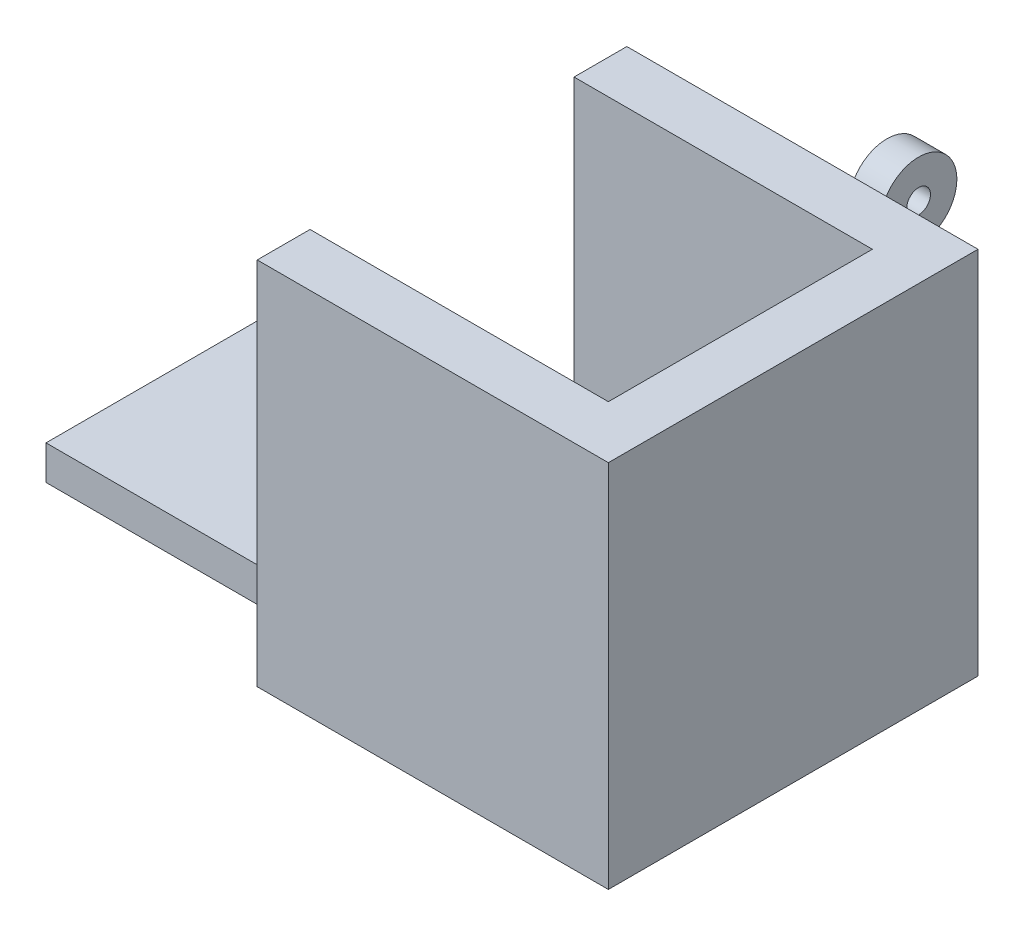
ISO-10303-21;
HEADER;
FILE_DESCRIPTION(('STEP AP214'),'2;1');
FILE_NAME('part.step','',(''),(''),'','','');
FILE_SCHEMA(('AUTOMOTIVE_DESIGN { 1 0 10303 214 1 1 1 1 }'));
ENDSEC;
DATA;
#1=APPLICATION_CONTEXT('core data for automotive mechanical design processes');
#2=APPLICATION_PROTOCOL_DEFINITION('international standard','automotive_design',2000,#1);
#3=PRODUCT_CONTEXT('',#1,'mechanical');
#4=PRODUCT('Part','Part','',(#3));
#5=PRODUCT_RELATED_PRODUCT_CATEGORY('part','',(#4));
#6=PRODUCT_DEFINITION_FORMATION('','',#4);
#7=PRODUCT_DEFINITION_CONTEXT('part definition',#1,'design');
#8=PRODUCT_DEFINITION('design','',#6,#7);
#9=PRODUCT_DEFINITION_SHAPE('','',#8);
#10=(LENGTH_UNIT() NAMED_UNIT(*) SI_UNIT(.MILLI.,.METRE.));
#11=(NAMED_UNIT(*) PLANE_ANGLE_UNIT() SI_UNIT($,.RADIAN.));
#12=(NAMED_UNIT(*) SI_UNIT($,.STERADIAN.) SOLID_ANGLE_UNIT());
#13=UNCERTAINTY_MEASURE_WITH_UNIT(LENGTH_MEASURE(1.E-05),#10,'distance_accuracy_value','');
#14=(GEOMETRIC_REPRESENTATION_CONTEXT(3) GLOBAL_UNCERTAINTY_ASSIGNED_CONTEXT((#13)) GLOBAL_UNIT_ASSIGNED_CONTEXT((#10,
#11,#12)) REPRESENTATION_CONTEXT('',''));
#15=CARTESIAN_POINT('',(0.,0.,0.));
#16=DIRECTION('',(0.,0.,1.));
#17=DIRECTION('',(1.,0.,0.));
#18=AXIS2_PLACEMENT_3D('',#15,#16,#17);
#19=CARTESIAN_POINT('',(-66.5,140.,-70.));
#20=DIRECTION('',(0.,0.,1.));
#21=DIRECTION('',(1.,0.,0.));
#22=AXIS2_PLACEMENT_3D('',#19,#20,#21);
#23=PLANE('',#22);
#24=DIRECTION('',(-1.,0.,0.));
#25=VECTOR('',#24,1.);
#26=CARTESIAN_POINT('',(-66.5,0.,-70.));
#27=LINE('',#26,#25);
#28=CARTESIAN_POINT('',(66.5,0.,-70.));
#29=VERTEX_POINT('',#28);
#30=CARTESIAN_POINT('',(-66.5,0.,-70.));
#31=VERTEX_POINT('',#30);
#32=EDGE_CURVE('E254',#29,#31,#27,.T.);
#33=ORIENTED_EDGE('',*,*,#32,.T.);
#34=DIRECTION('',(0.,-1.,0.));
#35=VECTOR('',#34,1.);
#36=CARTESIAN_POINT('',(-66.5,140.,-70.));
#37=LINE('',#36,#35);
#38=CARTESIAN_POINT('',(-66.5,140.,-70.));
#39=VERTEX_POINT('',#38);
#40=EDGE_CURVE('E46',#39,#31,#37,.T.);
#41=ORIENTED_EDGE('',*,*,#40,.F.);
#42=DIRECTION('',(-1.,0.,0.));
#43=VECTOR('',#42,1.);
#44=CARTESIAN_POINT('',(-66.5,140.,-70.));
#45=LINE('',#44,#43);
#46=CARTESIAN_POINT('',(66.5,140.,-70.));
#47=VERTEX_POINT('',#46);
#48=EDGE_CURVE('E242',#47,#39,#45,.T.);
#49=ORIENTED_EDGE('',*,*,#48,.F.);
#50=DIRECTION('',(0.,-1.,0.));
#51=VECTOR('',#50,1.);
#52=CARTESIAN_POINT('',(66.5,140.,-70.));
#53=LINE('',#52,#51);
#54=EDGE_CURVE('E12',#47,#29,#53,.T.);
#55=ORIENTED_EDGE('',*,*,#54,.T.);
#56=EDGE_LOOP('',(#33,#41,#49,#55));
#57=FACE_BOUND('',#56,.T.);
#58=DIRECTION('',(1.,0.,0.));
#59=VECTOR('',#58,1.);
#60=CARTESIAN_POINT('',(19.5,139.330471622785,-70.));
#61=LINE('',#60,#59);
#62=CARTESIAN_POINT('',(31.5,139.330471622785,-70.));
#63=VERTEX_POINT('',#62);
#64=CARTESIAN_POINT('',(19.5,139.330471622785,-70.));
#65=VERTEX_POINT('',#64);
#66=EDGE_CURVE('E150',#63,#65,#61,.F.);
#67=ORIENTED_EDGE('',*,*,#66,.T.);
#68=DIRECTION('',(0.,1.,0.));
#69=VECTOR('',#68,1.);
#70=CARTESIAN_POINT('',(19.5,132.,-70.));
#71=LINE('',#70,#69);
#72=CARTESIAN_POINT('',(19.5,120.,-70.));
#73=VERTEX_POINT('',#72);
#74=EDGE_CURVE('E53',#73,#65,#71,.T.);
#75=ORIENTED_EDGE('',*,*,#74,.F.);
#76=DIRECTION('',(-1.,0.,0.));
#77=VECTOR('',#76,1.);
#78=CARTESIAN_POINT('',(31.5,120.,-70.));
#79=LINE('',#78,#77);
#80=CARTESIAN_POINT('',(31.5,120.,-70.));
#81=VERTEX_POINT('',#80);
#82=EDGE_CURVE('E485',#81,#73,#79,.T.);
#83=ORIENTED_EDGE('',*,*,#82,.F.);
#84=DIRECTION('',(0.,-1.,0.));
#85=VECTOR('',#84,1.);
#86=CARTESIAN_POINT('',(31.5,132.,-70.));
#87=LINE('',#86,#85);
#88=EDGE_CURVE('E60',#63,#81,#87,.T.);
#89=ORIENTED_EDGE('',*,*,#88,.F.);
#90=EDGE_LOOP('',(#67,#75,#83,#89));
#91=FACE_BOUND('',#90,.T.);
#92=ADVANCED_FACE('F38',(#57,#91),#23,.F.);
#93=CARTESIAN_POINT('',(-66.5,140.,-70.));
#94=DIRECTION('',(1.,0.,0.));
#95=DIRECTION('',(0.,0.,-1.));
#96=AXIS2_PLACEMENT_3D('',#93,#94,#95);
#97=PLANE('',#96);
#98=DIRECTION('',(0.,0.,1.));
#99=VECTOR('',#98,1.);
#100=CARTESIAN_POINT('',(-66.5,30.,-50.));
#101=LINE('',#100,#99);
#102=CARTESIAN_POINT('',(-66.5,30.,-50.));
#103=VERTEX_POINT('',#102);
#104=CARTESIAN_POINT('',(-66.5,30.,50.));
#105=VERTEX_POINT('',#104);
#106=EDGE_CURVE('E210',#103,#105,#101,.T.);
#107=ORIENTED_EDGE('',*,*,#106,.F.);
#108=DIRECTION('',(0.,1.,0.));
#109=VECTOR('',#108,1.);
#110=CARTESIAN_POINT('',(-66.5,30.,-50.));
#111=LINE('',#110,#109);
#112=CARTESIAN_POINT('',(-66.5,140.,-50.));
#113=VERTEX_POINT('',#112);
#114=EDGE_CURVE('E230',#103,#113,#111,.T.);
#115=ORIENTED_EDGE('',*,*,#114,.T.);
#116=DIRECTION('',(0.,0.,1.));
#117=VECTOR('',#116,1.);
#118=CARTESIAN_POINT('',(-66.5,140.,-70.));
#119=LINE('',#118,#117);
#120=EDGE_CURVE('E246',#39,#113,#119,.T.);
#121=ORIENTED_EDGE('',*,*,#120,.F.);
#122=ORIENTED_EDGE('',*,*,#40,.T.);
#123=DIRECTION('',(0.,0.,1.));
#124=VECTOR('',#123,1.);
#125=CARTESIAN_POINT('',(-66.5,0.,-70.));
#126=LINE('',#125,#124);
#127=CARTESIAN_POINT('',(-66.5,0.,70.));
#128=VERTEX_POINT('',#127);
#129=EDGE_CURVE('E256',#31,#128,#126,.T.);
#130=ORIENTED_EDGE('',*,*,#129,.T.);
#131=DIRECTION('',(0.,-1.,0.));
#132=VECTOR('',#131,1.);
#133=CARTESIAN_POINT('',(-66.5,140.,70.));
#134=LINE('',#133,#132);
#135=CARTESIAN_POINT('',(-66.5,140.,70.));
#136=VERTEX_POINT('',#135);
#137=EDGE_CURVE('E261',#136,#128,#134,.T.);
#138=ORIENTED_EDGE('',*,*,#137,.F.);
#139=CARTESIAN_POINT('',(-66.5,140.,50.));
#140=VERTEX_POINT('',#139);
#141=EDGE_CURVE('E245',#140,#136,#119,.T.);
#142=ORIENTED_EDGE('',*,*,#141,.F.);
#143=DIRECTION('',(0.,1.,0.));
#144=VECTOR('',#143,1.);
#145=CARTESIAN_POINT('',(-66.5,30.,50.));
#146=LINE('',#145,#144);
#147=EDGE_CURVE('E223',#105,#140,#146,.T.);
#148=ORIENTED_EDGE('',*,*,#147,.F.);
#149=EDGE_LOOP('',(#107,#115,#121,#122,#130,#138,#142,#148));
#150=FACE_BOUND('',#149,.T.);
#151=DIRECTION('',(0.,-1.,0.));
#152=VECTOR('',#151,1.);
#153=CARTESIAN_POINT('',(-66.5,20.,-50.));
#154=LINE('',#153,#152);
#155=CARTESIAN_POINT('',(-66.5,20.,-50.));
#156=VERTEX_POINT('',#155);
#157=CARTESIAN_POINT('',(-66.5,7.00000000000001,-50.));
#158=VERTEX_POINT('',#157);
#159=EDGE_CURVE('E176',#156,#158,#154,.T.);
#160=ORIENTED_EDGE('',*,*,#159,.F.);
#161=DIRECTION('',(0.,0.,-1.));
#162=VECTOR('',#161,1.);
#163=CARTESIAN_POINT('',(-66.5,20.,-50.));
#164=LINE('',#163,#162);
#165=CARTESIAN_POINT('',(-66.5,20.,50.));
#166=VERTEX_POINT('',#165);
#167=EDGE_CURVE('E181',#166,#156,#164,.T.);
#168=ORIENTED_EDGE('',*,*,#167,.F.);
#169=DIRECTION('',(0.,1.,0.));
#170=VECTOR('',#169,1.);
#171=CARTESIAN_POINT('',(-66.5,20.,50.));
#172=LINE('',#171,#170);
#173=CARTESIAN_POINT('',(-66.5,7.00000000000001,50.));
#174=VERTEX_POINT('',#173);
#175=EDGE_CURVE('E193',#174,#166,#172,.T.);
#176=ORIENTED_EDGE('',*,*,#175,.F.);
#177=DIRECTION('',(0.,0.,1.));
#178=VECTOR('',#177,1.);
#179=CARTESIAN_POINT('',(-66.5,7.,-50.));
#180=LINE('',#179,#178);
#181=EDGE_CURVE('E190',#158,#174,#180,.T.);
#182=ORIENTED_EDGE('',*,*,#181,.F.);
#183=EDGE_LOOP('',(#160,#168,#176,#182));
#184=FACE_BOUND('',#183,.T.);
#185=ADVANCED_FACE('F269',(#150,#184),#97,.F.);
#186=CARTESIAN_POINT('',(66.5,140.,-70.));
#187=DIRECTION('',(-1.,0.,0.));
#188=DIRECTION('',(0.,0.,1.));
#189=AXIS2_PLACEMENT_3D('',#186,#187,#188);
#190=PLANE('',#189);
#191=DIRECTION('',(0.,0.,-1.));
#192=VECTOR('',#191,1.);
#193=CARTESIAN_POINT('',(66.5,0.,-70.));
#194=LINE('',#193,#192);
#195=CARTESIAN_POINT('',(66.5,0.,70.));
#196=VERTEX_POINT('',#195);
#197=EDGE_CURVE('E233',#196,#29,#194,.T.);
#198=ORIENTED_EDGE('',*,*,#197,.T.);
#199=ORIENTED_EDGE('',*,*,#54,.F.);
#200=DIRECTION('',(0.,0.,-1.));
#201=VECTOR('',#200,1.);
#202=CARTESIAN_POINT('',(66.5,140.,-70.));
#203=LINE('',#202,#201);
#204=CARTESIAN_POINT('',(66.5,140.,70.));
#205=VERTEX_POINT('',#204);
#206=EDGE_CURVE('E239',#205,#47,#203,.T.);
#207=ORIENTED_EDGE('',*,*,#206,.F.);
#208=DIRECTION('',(0.,-1.,0.));
#209=VECTOR('',#208,1.);
#210=CARTESIAN_POINT('',(66.5,140.,70.));
#211=LINE('',#210,#209);
#212=EDGE_CURVE('E251',#205,#196,#211,.T.);
#213=ORIENTED_EDGE('',*,*,#212,.T.);
#214=EDGE_LOOP('',(#198,#199,#207,#213));
#215=FACE_BOUND('',#214,.T.);
#216=ADVANCED_FACE('F40',(#215),#190,.F.);
#217=CARTESIAN_POINT('',(-66.5,140.,70.));
#218=DIRECTION('',(0.,0.,-1.));
#219=DIRECTION('',(-1.,0.,0.));
#220=AXIS2_PLACEMENT_3D('',#217,#218,#219);
#221=PLANE('',#220);
#222=DIRECTION('',(1.,0.,0.));
#223=VECTOR('',#222,1.);
#224=CARTESIAN_POINT('',(-66.5,0.,70.));
#225=LINE('',#224,#223);
#226=EDGE_CURVE('E243',#128,#196,#225,.T.);
#227=ORIENTED_EDGE('',*,*,#226,.T.);
#228=ORIENTED_EDGE('',*,*,#212,.F.);
#229=DIRECTION('',(1.,0.,0.));
#230=VECTOR('',#229,1.);
#231=CARTESIAN_POINT('',(-66.5,140.,70.));
#232=LINE('',#231,#230);
#233=EDGE_CURVE('E249',#136,#205,#232,.T.);
#234=ORIENTED_EDGE('',*,*,#233,.F.);
#235=ORIENTED_EDGE('',*,*,#137,.T.);
#236=EDGE_LOOP('',(#227,#228,#234,#235));
#237=FACE_BOUND('',#236,.T.);
#238=ADVANCED_FACE('F279',(#237),#221,.F.);
#239=CARTESIAN_POINT('',(0.,140.,0.));
#240=DIRECTION('',(0.,1.,0.));
#241=DIRECTION('',(0.,0.,1.));
#242=AXIS2_PLACEMENT_3D('',#239,#240,#241);
#243=PLANE('',#242);
#244=DIRECTION('',(-1.,0.,0.));
#245=VECTOR('',#244,1.);
#246=CARTESIAN_POINT('',(-66.5,140.,-50.));
#247=LINE('',#246,#245);
#248=CARTESIAN_POINT('',(46.5,140.,-50.));
#249=VERTEX_POINT('',#248);
#250=EDGE_CURVE('E214',#249,#113,#247,.T.);
#251=ORIENTED_EDGE('',*,*,#250,.F.);
#252=DIRECTION('',(0.,0.,-1.));
#253=VECTOR('',#252,1.);
#254=CARTESIAN_POINT('',(46.5,140.,-50.));
#255=LINE('',#254,#253);
#256=CARTESIAN_POINT('',(46.5,140.,50.));
#257=VERTEX_POINT('',#256);
#258=EDGE_CURVE('E226',#257,#249,#255,.T.);
#259=ORIENTED_EDGE('',*,*,#258,.F.);
#260=DIRECTION('',(1.,0.,0.));
#261=VECTOR('',#260,1.);
#262=CARTESIAN_POINT('',(-66.5,140.,50.));
#263=LINE('',#262,#261);
#264=EDGE_CURVE('E209',#140,#257,#263,.T.);
#265=ORIENTED_EDGE('',*,*,#264,.F.);
#266=ORIENTED_EDGE('',*,*,#141,.T.);
#267=ORIENTED_EDGE('',*,*,#233,.T.);
#268=ORIENTED_EDGE('',*,*,#206,.T.);
#269=ORIENTED_EDGE('',*,*,#48,.T.);
#270=ORIENTED_EDGE('',*,*,#120,.T.);
#271=EDGE_LOOP('',(#251,#259,#265,#266,#267,#268,#269,#270));
#272=FACE_BOUND('',#271,.T.);
#273=ADVANCED_FACE('F286',(#272),#243,.T.);
#274=CARTESIAN_POINT('',(0.,0.,0.));
#275=DIRECTION('',(0.,1.,0.));
#276=DIRECTION('',(0.,0.,1.));
#277=AXIS2_PLACEMENT_3D('',#274,#275,#276);
#278=PLANE('',#277);
#279=ORIENTED_EDGE('',*,*,#197,.F.);
#280=ORIENTED_EDGE('',*,*,#226,.F.);
#281=ORIENTED_EDGE('',*,*,#129,.F.);
#282=ORIENTED_EDGE('',*,*,#32,.F.);
#283=EDGE_LOOP('',(#279,#280,#281,#282));
#284=FACE_BOUND('',#283,.T.);
#285=ADVANCED_FACE('F276',(#284),#278,.F.);
#286=CARTESIAN_POINT('',(-66.5,30.,-50.));
#287=DIRECTION('',(0.,0.,-1.));
#288=DIRECTION('',(-1.,0.,0.));
#289=AXIS2_PLACEMENT_3D('',#286,#287,#288);
#290=PLANE('',#289);
#291=ORIENTED_EDGE('',*,*,#250,.T.);
#292=ORIENTED_EDGE('',*,*,#114,.F.);
#293=DIRECTION('',(-1.,0.,0.));
#294=VECTOR('',#293,1.);
#295=CARTESIAN_POINT('',(-66.5,30.,-50.));
#296=LINE('',#295,#294);
#297=CARTESIAN_POINT('',(46.5,30.,-50.));
#298=VERTEX_POINT('',#297);
#299=EDGE_CURVE('E220',#298,#103,#296,.T.);
#300=ORIENTED_EDGE('',*,*,#299,.F.);
#301=DIRECTION('',(0.,1.,0.));
#302=VECTOR('',#301,1.);
#303=CARTESIAN_POINT('',(46.5,30.,-50.));
#304=LINE('',#303,#302);
#305=EDGE_CURVE('E234',#298,#249,#304,.T.);
#306=ORIENTED_EDGE('',*,*,#305,.T.);
#307=EDGE_LOOP('',(#291,#292,#300,#306));
#308=FACE_BOUND('',#307,.T.);
#309=ADVANCED_FACE('F298',(#308),#290,.F.);
#310=CARTESIAN_POINT('',(46.5,30.,-50.));
#311=DIRECTION('',(1.,0.,0.));
#312=DIRECTION('',(0.,0.,-1.));
#313=AXIS2_PLACEMENT_3D('',#310,#311,#312);
#314=PLANE('',#313);
#315=ORIENTED_EDGE('',*,*,#258,.T.);
#316=ORIENTED_EDGE('',*,*,#305,.F.);
#317=DIRECTION('',(0.,0.,-1.));
#318=VECTOR('',#317,1.);
#319=CARTESIAN_POINT('',(46.5,30.,-50.));
#320=LINE('',#319,#318);
#321=CARTESIAN_POINT('',(46.5,30.,50.));
#322=VERTEX_POINT('',#321);
#323=EDGE_CURVE('E217',#322,#298,#320,.T.);
#324=ORIENTED_EDGE('',*,*,#323,.F.);
#325=DIRECTION('',(0.,1.,0.));
#326=VECTOR('',#325,1.);
#327=CARTESIAN_POINT('',(46.5,30.,50.));
#328=LINE('',#327,#326);
#329=EDGE_CURVE('E236',#322,#257,#328,.T.);
#330=ORIENTED_EDGE('',*,*,#329,.T.);
#331=EDGE_LOOP('',(#315,#316,#324,#330));
#332=FACE_BOUND('',#331,.T.);
#333=ADVANCED_FACE('F300',(#332),#314,.F.);
#334=CARTESIAN_POINT('',(-66.5,30.,50.));
#335=DIRECTION('',(0.,0.,1.));
#336=DIRECTION('',(1.,0.,0.));
#337=AXIS2_PLACEMENT_3D('',#334,#335,#336);
#338=PLANE('',#337);
#339=ORIENTED_EDGE('',*,*,#264,.T.);
#340=ORIENTED_EDGE('',*,*,#329,.F.);
#341=DIRECTION('',(1.,0.,0.));
#342=VECTOR('',#341,1.);
#343=CARTESIAN_POINT('',(-66.5,30.,50.));
#344=LINE('',#343,#342);
#345=EDGE_CURVE('E213',#105,#322,#344,.T.);
#346=ORIENTED_EDGE('',*,*,#345,.F.);
#347=ORIENTED_EDGE('',*,*,#147,.T.);
#348=EDGE_LOOP('',(#339,#340,#346,#347));
#349=FACE_BOUND('',#348,.T.);
#350=ADVANCED_FACE('F292',(#349),#338,.F.);
#351=CARTESIAN_POINT('',(0.,30.,0.));
#352=DIRECTION('',(0.,1.,0.));
#353=DIRECTION('',(0.,0.,1.));
#354=AXIS2_PLACEMENT_3D('',#351,#352,#353);
#355=PLANE('',#354);
#356=ORIENTED_EDGE('',*,*,#106,.T.);
#357=ORIENTED_EDGE('',*,*,#345,.T.);
#358=ORIENTED_EDGE('',*,*,#323,.T.);
#359=ORIENTED_EDGE('',*,*,#299,.T.);
#360=EDGE_LOOP('',(#356,#357,#358,#359));
#361=FACE_BOUND('',#360,.T.);
#362=ADVANCED_FACE('F295',(#361),#355,.T.);
#363=CARTESIAN_POINT('',(-166.5,20.,-50.));
#364=DIRECTION('',(0.,0.,1.));
#365=DIRECTION('',(1.,0.,0.));
#366=AXIS2_PLACEMENT_3D('',#363,#364,#365);
#367=PLANE('',#366);
#368=ORIENTED_EDGE('',*,*,#159,.T.);
#369=DIRECTION('',(1.,0.,0.));
#370=VECTOR('',#369,1.);
#371=CARTESIAN_POINT('',(-166.5,7.,-50.));
#372=LINE('',#371,#370);
#373=CARTESIAN_POINT('',(-166.5,7.,-50.));
#374=VERTEX_POINT('',#373);
#375=EDGE_CURVE('E206',#374,#158,#372,.T.);
#376=ORIENTED_EDGE('',*,*,#375,.F.);
#377=DIRECTION('',(0.,-1.,0.));
#378=VECTOR('',#377,1.);
#379=CARTESIAN_POINT('',(-166.5,20.,-50.));
#380=LINE('',#379,#378);
#381=CARTESIAN_POINT('',(-166.5,20.,-50.));
#382=VERTEX_POINT('',#381);
#383=EDGE_CURVE('E177',#382,#374,#380,.T.);
#384=ORIENTED_EDGE('',*,*,#383,.F.);
#385=DIRECTION('',(1.,0.,0.));
#386=VECTOR('',#385,1.);
#387=CARTESIAN_POINT('',(-166.5,20.,-50.));
#388=LINE('',#387,#386);
#389=EDGE_CURVE('E187',#382,#156,#388,.T.);
#390=ORIENTED_EDGE('',*,*,#389,.T.);
#391=EDGE_LOOP('',(#368,#376,#384,#390));
#392=FACE_BOUND('',#391,.T.);
#393=ADVANCED_FACE('F352',(#392),#367,.F.);
#394=CARTESIAN_POINT('',(-166.5,7.,-50.));
#395=DIRECTION('',(0.,1.,0.));
#396=DIRECTION('',(0.,0.,1.));
#397=AXIS2_PLACEMENT_3D('',#394,#395,#396);
#398=PLANE('',#397);
#399=CARTESIAN_POINT('',(-86.5,7.,0.));
#400=DIRECTION('',(0.,1.,0.));
#401=DIRECTION('',(0.,0.,1.));
#402=AXIS2_PLACEMENT_3D('',#399,#400,#401);
#403=CIRCLE('',#402,3.00000000000001);
#404=CARTESIAN_POINT('',(-86.5,7.,3.00000000000001));
#405=VERTEX_POINT('',#404);
#406=EDGE_CURVE('E169',#405,#405,#403,.T.);
#407=ORIENTED_EDGE('',*,*,#406,.T.);
#408=EDGE_LOOP('',(#407));
#409=FACE_BOUND('',#408,.T.);
#410=ORIENTED_EDGE('',*,*,#181,.T.);
#411=DIRECTION('',(1.,0.,0.));
#412=VECTOR('',#411,1.);
#413=CARTESIAN_POINT('',(-166.5,7.,50.));
#414=LINE('',#413,#412);
#415=CARTESIAN_POINT('',(-166.5,7.,50.));
#416=VERTEX_POINT('',#415);
#417=EDGE_CURVE('E203',#416,#174,#414,.T.);
#418=ORIENTED_EDGE('',*,*,#417,.F.);
#419=DIRECTION('',(0.,0.,1.));
#420=VECTOR('',#419,1.);
#421=CARTESIAN_POINT('',(-166.5,7.,-50.));
#422=LINE('',#421,#420);
#423=EDGE_CURVE('E180',#374,#416,#422,.T.);
#424=ORIENTED_EDGE('',*,*,#423,.F.);
#425=ORIENTED_EDGE('',*,*,#375,.T.);
#426=EDGE_LOOP('',(#410,#418,#424,#425));
#427=FACE_BOUND('',#426,.T.);
#428=ADVANCED_FACE('F367',(#409,#427),#398,.F.);
#429=CARTESIAN_POINT('',(-166.5,20.,50.));
#430=DIRECTION('',(0.,0.,-1.));
#431=DIRECTION('',(-1.,0.,0.));
#432=AXIS2_PLACEMENT_3D('',#429,#430,#431);
#433=PLANE('',#432);
#434=ORIENTED_EDGE('',*,*,#175,.T.);
#435=DIRECTION('',(1.,0.,0.));
#436=VECTOR('',#435,1.);
#437=CARTESIAN_POINT('',(-166.5,20.,50.));
#438=LINE('',#437,#436);
#439=CARTESIAN_POINT('',(-166.5,20.,50.));
#440=VERTEX_POINT('',#439);
#441=EDGE_CURVE('E200',#440,#166,#438,.T.);
#442=ORIENTED_EDGE('',*,*,#441,.F.);
#443=DIRECTION('',(0.,1.,0.));
#444=VECTOR('',#443,1.);
#445=CARTESIAN_POINT('',(-166.5,20.,50.));
#446=LINE('',#445,#444);
#447=EDGE_CURVE('E183',#416,#440,#446,.T.);
#448=ORIENTED_EDGE('',*,*,#447,.F.);
#449=ORIENTED_EDGE('',*,*,#417,.T.);
#450=EDGE_LOOP('',(#434,#442,#448,#449));
#451=FACE_BOUND('',#450,.T.);
#452=ADVANCED_FACE('F375',(#451),#433,.F.);
#453=CARTESIAN_POINT('',(-166.5,20.,-50.));
#454=DIRECTION('',(0.,-1.,0.));
#455=DIRECTION('',(0.,0.,-1.));
#456=AXIS2_PLACEMENT_3D('',#453,#454,#455);
#457=PLANE('',#456);
#458=CARTESIAN_POINT('',(-86.5,20.,0.));
#459=DIRECTION('',(0.,1.,0.));
#460=DIRECTION('',(0.,0.,1.));
#461=AXIS2_PLACEMENT_3D('',#458,#459,#460);
#462=CIRCLE('',#461,3.00000000000001);
#463=CARTESIAN_POINT('',(-86.5,20.,3.00000000000001));
#464=VERTEX_POINT('',#463);
#465=EDGE_CURVE('E166',#464,#464,#462,.T.);
#466=ORIENTED_EDGE('',*,*,#465,.F.);
#467=EDGE_LOOP('',(#466));
#468=FACE_BOUND('',#467,.T.);
#469=ORIENTED_EDGE('',*,*,#167,.T.);
#470=ORIENTED_EDGE('',*,*,#389,.F.);
#471=DIRECTION('',(0.,0.,-1.));
#472=VECTOR('',#471,1.);
#473=CARTESIAN_POINT('',(-166.5,20.,-50.));
#474=LINE('',#473,#472);
#475=EDGE_CURVE('E185',#440,#382,#474,.T.);
#476=ORIENTED_EDGE('',*,*,#475,.F.);
#477=ORIENTED_EDGE('',*,*,#441,.T.);
#478=EDGE_LOOP('',(#469,#470,#476,#477));
#479=FACE_BOUND('',#478,.T.);
#480=ADVANCED_FACE('F380',(#468,#479),#457,.F.);
#481=CARTESIAN_POINT('',(-166.5,0.,0.));
#482=DIRECTION('',(-1.,0.,0.));
#483=DIRECTION('',(0.,0.,1.));
#484=AXIS2_PLACEMENT_3D('',#481,#482,#483);
#485=PLANE('',#484);
#486=ORIENTED_EDGE('',*,*,#383,.T.);
#487=ORIENTED_EDGE('',*,*,#423,.T.);
#488=ORIENTED_EDGE('',*,*,#447,.T.);
#489=ORIENTED_EDGE('',*,*,#475,.T.);
#490=EDGE_LOOP('',(#486,#487,#488,#489));
#491=FACE_BOUND('',#490,.T.);
#492=ADVANCED_FACE('F388',(#491),#485,.T.);
#493=CARTESIAN_POINT('',(-86.5,0.,0.));
#494=DIRECTION('',(0.,1.,0.));
#495=DIRECTION('',(0.,0.,1.));
#496=AXIS2_PLACEMENT_3D('',#493,#494,#495);
#497=CYLINDRICAL_SURFACE('',#496,3.00000000000001);
#498=ORIENTED_EDGE('',*,*,#465,.T.);
#499=EDGE_LOOP('',(#498));
#500=FACE_BOUND('',#499,.T.);
#501=ORIENTED_EDGE('',*,*,#406,.F.);
#502=EDGE_LOOP('',(#501));
#503=FACE_BOUND('',#502,.T.);
#504=ADVANCED_FACE('F393',(#500,#503),#497,.F.);
#505=CARTESIAN_POINT('',(31.5,132.,-80.));
#506=DIRECTION('',(-1.,0.,0.));
#507=DIRECTION('',(0.,0.,1.));
#508=AXIS2_PLACEMENT_3D('',#505,#506,#507);
#509=PLANE('',#508);
#510=DIRECTION('',(0.,0.,1.));
#511=VECTOR('',#510,1.);
#512=CARTESIAN_POINT('',(31.5,120.,-80.));
#513=LINE('',#512,#511);
#514=CARTESIAN_POINT('',(31.5,120.,-74.3768347171525));
#515=VERTEX_POINT('',#514);
#516=EDGE_CURVE('E161',#515,#81,#513,.T.);
#517=ORIENTED_EDGE('',*,*,#516,.F.);
#518=CARTESIAN_POINT('',(31.5,132.,-82.5));
#519=DIRECTION('',(1.,0.,0.));
#520=DIRECTION('',(0.,0.,-1.));
#521=AXIS2_PLACEMENT_3D('',#518,#519,#520);
#522=CIRCLE('',#521,14.4908872817526);
#523=EDGE_CURVE('E145',#515,#63,#522,.T.);
#524=ORIENTED_EDGE('',*,*,#523,.T.);
#525=ORIENTED_EDGE('',*,*,#88,.T.);
#526=EDGE_LOOP('',(#517,#524,#525));
#527=FACE_BOUND('',#526,.T.);
#528=CARTESIAN_POINT('',(31.5,132.,-82.5));
#529=DIRECTION('',(1.,0.,0.));
#530=DIRECTION('',(0.,0.,-1.));
#531=AXIS2_PLACEMENT_3D('',#528,#529,#530);
#532=CIRCLE('',#531,4.4908872817526);
#533=CARTESIAN_POINT('',(31.5,132.,-86.9908872817526));
#534=VERTEX_POINT('',#533);
#535=EDGE_CURVE('E478',#534,#534,#532,.T.);
#536=ORIENTED_EDGE('',*,*,#535,.F.);
#537=EDGE_LOOP('',(#536));
#538=FACE_BOUND('',#537,.T.);
#539=ADVANCED_FACE('F164',(#527,#538),#509,.F.);
#540=CARTESIAN_POINT('',(31.5,120.,-80.));
#541=DIRECTION('',(0.,1.,0.));
#542=DIRECTION('',(0.,0.,1.));
#543=AXIS2_PLACEMENT_3D('',#540,#541,#542);
#544=PLANE('',#543);
#545=DIRECTION('',(0.,0.,1.));
#546=VECTOR('',#545,1.);
#547=CARTESIAN_POINT('',(19.5,120.,-80.));
#548=LINE('',#547,#546);
#549=CARTESIAN_POINT('',(19.5,120.,-74.3768347171525));
#550=VERTEX_POINT('',#549);
#551=EDGE_CURVE('E162',#550,#73,#548,.T.);
#552=ORIENTED_EDGE('',*,*,#551,.F.);
#553=DIRECTION('',(1.,0.,0.));
#554=VECTOR('',#553,1.);
#555=CARTESIAN_POINT('',(19.5,120.,-74.3768347171525));
#556=LINE('',#555,#554);
#557=EDGE_CURVE('E149',#550,#515,#556,.T.);
#558=ORIENTED_EDGE('',*,*,#557,.T.);
#559=ORIENTED_EDGE('',*,*,#516,.T.);
#560=ORIENTED_EDGE('',*,*,#82,.T.);
#561=EDGE_LOOP('',(#552,#558,#559,#560));
#562=FACE_BOUND('',#561,.T.);
#563=ADVANCED_FACE('F159',(#562),#544,.F.);
#564=CARTESIAN_POINT('',(19.5,132.,-80.));
#565=DIRECTION('',(1.,0.,0.));
#566=DIRECTION('',(0.,0.,-1.));
#567=AXIS2_PLACEMENT_3D('',#564,#565,#566);
#568=PLANE('',#567);
#569=CARTESIAN_POINT('',(19.5,132.,-82.5));
#570=DIRECTION('',(1.,0.,0.));
#571=DIRECTION('',(0.,0.,-1.));
#572=AXIS2_PLACEMENT_3D('',#569,#570,#571);
#573=CIRCLE('',#572,14.4908872817526);
#574=EDGE_CURVE('E153',#550,#65,#573,.T.);
#575=ORIENTED_EDGE('',*,*,#574,.F.);
#576=ORIENTED_EDGE('',*,*,#551,.T.);
#577=ORIENTED_EDGE('',*,*,#74,.T.);
#578=EDGE_LOOP('',(#575,#576,#577));
#579=FACE_BOUND('',#578,.T.);
#580=CARTESIAN_POINT('',(19.5,132.,-82.5));
#581=DIRECTION('',(1.,0.,0.));
#582=DIRECTION('',(0.,0.,-1.));
#583=AXIS2_PLACEMENT_3D('',#580,#581,#582);
#584=CIRCLE('',#583,4.4908872817526);
#585=CARTESIAN_POINT('',(19.5,132.,-86.9908872817526));
#586=VERTEX_POINT('',#585);
#587=EDGE_CURVE('E154',#586,#586,#584,.T.);
#588=ORIENTED_EDGE('',*,*,#587,.T.);
#589=EDGE_LOOP('',(#588));
#590=FACE_BOUND('',#589,.T.);
#591=ADVANCED_FACE('F434',(#579,#590),#568,.F.);
#592=CARTESIAN_POINT('',(19.5,132.,-82.5));
#593=DIRECTION('',(1.,0.,0.));
#594=DIRECTION('',(0.,0.,-1.));
#595=AXIS2_PLACEMENT_3D('',#592,#593,#594);
#596=CYLINDRICAL_SURFACE('',#595,14.4908872817526);
#597=ORIENTED_EDGE('',*,*,#66,.F.);
#598=ORIENTED_EDGE('',*,*,#523,.F.);
#599=ORIENTED_EDGE('',*,*,#557,.F.);
#600=ORIENTED_EDGE('',*,*,#574,.T.);
#601=EDGE_LOOP('',(#597,#598,#599,#600));
#602=FACE_BOUND('',#601,.T.);
#603=ADVANCED_FACE('F147',(#602),#596,.T.);
#604=CARTESIAN_POINT('',(19.5,132.,-82.5));
#605=DIRECTION('',(1.,0.,0.));
#606=DIRECTION('',(0.,0.,-1.));
#607=AXIS2_PLACEMENT_3D('',#604,#605,#606);
#608=CYLINDRICAL_SURFACE('',#607,4.4908872817526);
#609=ORIENTED_EDGE('',*,*,#587,.F.);
#610=EDGE_LOOP('',(#609));
#611=FACE_BOUND('',#610,.T.);
#612=ORIENTED_EDGE('',*,*,#535,.T.);
#613=EDGE_LOOP('',(#612));
#614=FACE_BOUND('',#613,.T.);
#615=ADVANCED_FACE('F444',(#611,#614),#608,.F.);
#616=CLOSED_SHELL('',(#92,#185,#216,#238,#273,#285,#309,#333,#350,#362,#393,#428,#452,#480,#492,
#504,#539,#563,#591,#603,#615));
#617=MANIFOLD_SOLID_BREP('B2',#616);
#618=ADVANCED_BREP_SHAPE_REPRESENTATION('',(#18,#617),#14);
#619=SHAPE_DEFINITION_REPRESENTATION(#9,#618);
ENDSEC;
END-ISO-10303-21;
